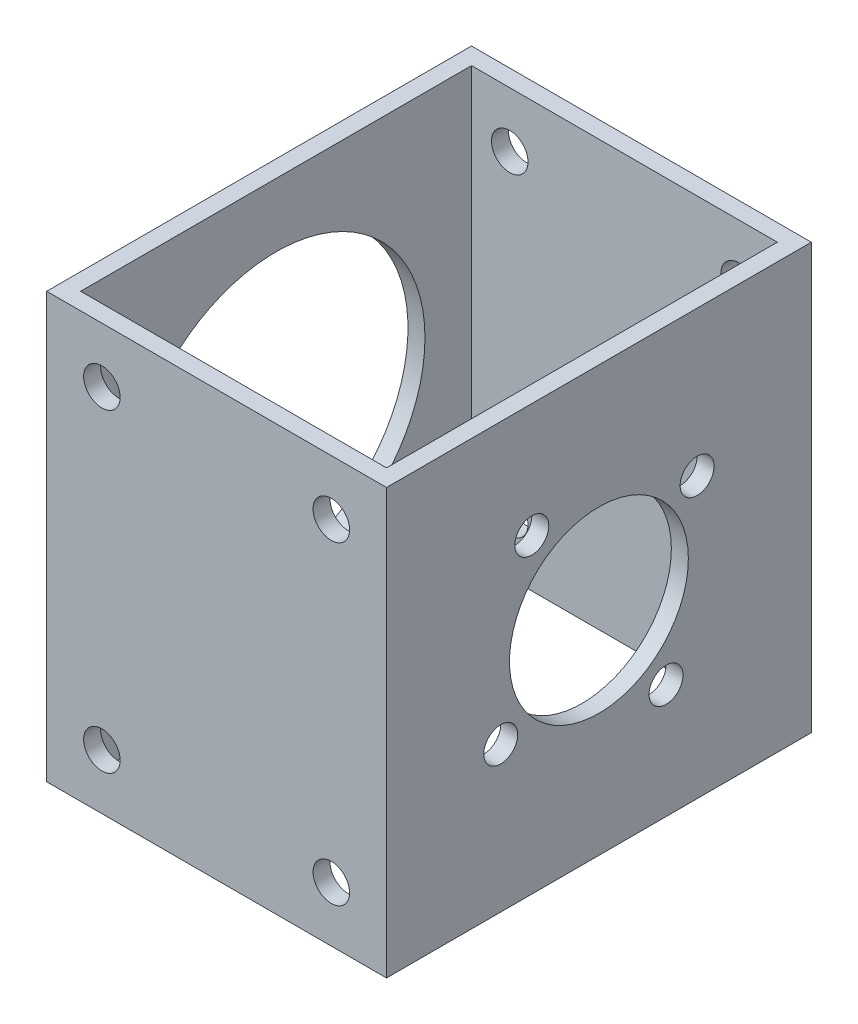
ISO-10303-21;
HEADER;
FILE_DESCRIPTION(('STEP AP214'),'2;1');
FILE_NAME('part.step','',(''),(''),'','','');
FILE_SCHEMA(('AUTOMOTIVE_DESIGN { 1 0 10303 214 1 1 1 1 }'));
ENDSEC;
DATA;
#1=APPLICATION_CONTEXT('core data for automotive mechanical design processes');
#2=APPLICATION_PROTOCOL_DEFINITION('international standard','automotive_design',2000,#1);
#3=PRODUCT_CONTEXT('',#1,'mechanical');
#4=PRODUCT('Part','Part','',(#3));
#5=PRODUCT_RELATED_PRODUCT_CATEGORY('part','',(#4));
#6=PRODUCT_DEFINITION_FORMATION('','',#4);
#7=PRODUCT_DEFINITION_CONTEXT('part definition',#1,'design');
#8=PRODUCT_DEFINITION('design','',#6,#7);
#9=PRODUCT_DEFINITION_SHAPE('','',#8);
#10=(LENGTH_UNIT() NAMED_UNIT(*) SI_UNIT(.MILLI.,.METRE.));
#11=(NAMED_UNIT(*) PLANE_ANGLE_UNIT() SI_UNIT($,.RADIAN.));
#12=(NAMED_UNIT(*) SI_UNIT($,.STERADIAN.) SOLID_ANGLE_UNIT());
#13=UNCERTAINTY_MEASURE_WITH_UNIT(LENGTH_MEASURE(1.E-05),#10,'distance_accuracy_value','');
#14=(GEOMETRIC_REPRESENTATION_CONTEXT(3) GLOBAL_UNCERTAINTY_ASSIGNED_CONTEXT((#13)) GLOBAL_UNIT_ASSIGNED_CONTEXT((#10,
#11,#12)) REPRESENTATION_CONTEXT('',''));
#15=CARTESIAN_POINT('',(0.,0.,0.));
#16=DIRECTION('',(0.,0.,1.));
#17=DIRECTION('',(1.,0.,0.));
#18=AXIS2_PLACEMENT_3D('',#15,#16,#17);
#19=CARTESIAN_POINT('',(0.,50.,0.));
#20=DIRECTION('',(0.,1.,0.));
#21=DIRECTION('',(0.,0.,1.));
#22=AXIS2_PLACEMENT_3D('',#19,#20,#21);
#23=PLANE('',#22);
#24=DIRECTION('',(0.,0.,1.));
#25=VECTOR('',#24,1.);
#26=CARTESIAN_POINT('',(0.,50.,0.));
#27=LINE('',#26,#25);
#28=CARTESIAN_POINT('',(0.,50.,0.));
#29=VERTEX_POINT('',#28);
#30=CARTESIAN_POINT('',(0.,50.,50.));
#31=VERTEX_POINT('',#30);
#32=EDGE_CURVE('E141',#29,#31,#27,.T.);
#33=ORIENTED_EDGE('',*,*,#32,.T.);
#34=DIRECTION('',(1.,0.,0.));
#35=VECTOR('',#34,1.);
#36=CARTESIAN_POINT('',(0.,50.,50.));
#37=LINE('',#36,#35);
#38=CARTESIAN_POINT('',(40.,50.,50.));
#39=VERTEX_POINT('',#38);
#40=EDGE_CURVE('E144',#31,#39,#37,.T.);
#41=ORIENTED_EDGE('',*,*,#40,.T.);
#42=DIRECTION('',(0.,0.,-1.));
#43=VECTOR('',#42,1.);
#44=CARTESIAN_POINT('',(40.,50.,0.));
#45=LINE('',#44,#43);
#46=CARTESIAN_POINT('',(40.,50.,0.));
#47=VERTEX_POINT('',#46);
#48=EDGE_CURVE('E147',#39,#47,#45,.T.);
#49=ORIENTED_EDGE('',*,*,#48,.T.);
#50=DIRECTION('',(-1.,0.,0.));
#51=VECTOR('',#50,1.);
#52=CARTESIAN_POINT('',(0.,50.,0.));
#53=LINE('',#52,#51);
#54=EDGE_CURVE('E149',#47,#29,#53,.T.);
#55=ORIENTED_EDGE('',*,*,#54,.T.);
#56=EDGE_LOOP('',(#33,#41,#49,#55));
#57=FACE_BOUND('',#56,.T.);
#58=DIRECTION('',(1.,0.,0.));
#59=VECTOR('',#58,1.);
#60=CARTESIAN_POINT('',(2.00000000000001,50.,48.));
#61=LINE('',#60,#59);
#62=CARTESIAN_POINT('',(2.00000000000001,50.,48.));
#63=VERTEX_POINT('',#62);
#64=CARTESIAN_POINT('',(38.,50.,48.));
#65=VERTEX_POINT('',#64);
#66=EDGE_CURVE('E111',#63,#65,#61,.T.);
#67=ORIENTED_EDGE('',*,*,#66,.F.);
#68=DIRECTION('',(0.,0.,1.));
#69=VECTOR('',#68,1.);
#70=CARTESIAN_POINT('',(2.,50.,2.));
#71=LINE('',#70,#69);
#72=CARTESIAN_POINT('',(2.,50.,2.));
#73=VERTEX_POINT('',#72);
#74=EDGE_CURVE('E103',#73,#63,#71,.T.);
#75=ORIENTED_EDGE('',*,*,#74,.F.);
#76=DIRECTION('',(-1.,0.,0.));
#77=VECTOR('',#76,1.);
#78=CARTESIAN_POINT('',(2.,50.,2.));
#79=LINE('',#78,#77);
#80=CARTESIAN_POINT('',(38.,50.,2.));
#81=VERTEX_POINT('',#80);
#82=EDGE_CURVE('E125',#81,#73,#79,.T.);
#83=ORIENTED_EDGE('',*,*,#82,.F.);
#84=DIRECTION('',(0.,0.,-1.));
#85=VECTOR('',#84,1.);
#86=CARTESIAN_POINT('',(38.,50.,2.));
#87=LINE('',#86,#85);
#88=EDGE_CURVE('E123',#65,#81,#87,.T.);
#89=ORIENTED_EDGE('',*,*,#88,.F.);
#90=EDGE_LOOP('',(#67,#75,#83,#89));
#91=FACE_BOUND('',#90,.T.);
#92=ADVANCED_FACE('F36',(#57,#91),#23,.T.);
#93=CARTESIAN_POINT('',(0.,0.,0.));
#94=DIRECTION('',(0.,1.,0.));
#95=DIRECTION('',(0.,0.,1.));
#96=AXIS2_PLACEMENT_3D('',#93,#94,#95);
#97=PLANE('',#96);
#98=DIRECTION('',(0.,0.,1.));
#99=VECTOR('',#98,1.);
#100=CARTESIAN_POINT('',(0.,0.,0.));
#101=LINE('',#100,#99);
#102=CARTESIAN_POINT('',(0.,0.,0.));
#103=VERTEX_POINT('',#102);
#104=CARTESIAN_POINT('',(0.,0.,50.));
#105=VERTEX_POINT('',#104);
#106=EDGE_CURVE('E119',#103,#105,#101,.T.);
#107=ORIENTED_EDGE('',*,*,#106,.F.);
#108=DIRECTION('',(-1.,0.,0.));
#109=VECTOR('',#108,1.);
#110=CARTESIAN_POINT('',(0.,0.,0.));
#111=LINE('',#110,#109);
#112=CARTESIAN_POINT('',(40.,0.,0.));
#113=VERTEX_POINT('',#112);
#114=EDGE_CURVE('E145',#113,#103,#111,.T.);
#115=ORIENTED_EDGE('',*,*,#114,.F.);
#116=DIRECTION('',(0.,0.,-1.));
#117=VECTOR('',#116,1.);
#118=CARTESIAN_POINT('',(40.,0.,0.));
#119=LINE('',#118,#117);
#120=CARTESIAN_POINT('',(40.,0.,50.));
#121=VERTEX_POINT('',#120);
#122=EDGE_CURVE('E156',#121,#113,#119,.T.);
#123=ORIENTED_EDGE('',*,*,#122,.F.);
#124=DIRECTION('',(1.,0.,0.));
#125=VECTOR('',#124,1.);
#126=CARTESIAN_POINT('',(0.,0.,50.));
#127=LINE('',#126,#125);
#128=EDGE_CURVE('E154',#105,#121,#127,.T.);
#129=ORIENTED_EDGE('',*,*,#128,.F.);
#130=EDGE_LOOP('',(#107,#115,#123,#129));
#131=FACE_BOUND('',#130,.T.);
#132=DIRECTION('',(0.,0.,1.));
#133=VECTOR('',#132,1.);
#134=CARTESIAN_POINT('',(2.,0.,2.));
#135=LINE('',#134,#133);
#136=CARTESIAN_POINT('',(2.,0.,2.));
#137=VERTEX_POINT('',#136);
#138=CARTESIAN_POINT('',(2.00000000000001,0.,48.));
#139=VERTEX_POINT('',#138);
#140=EDGE_CURVE('E61',#137,#139,#135,.T.);
#141=ORIENTED_EDGE('',*,*,#140,.T.);
#142=DIRECTION('',(1.,0.,0.));
#143=VECTOR('',#142,1.);
#144=CARTESIAN_POINT('',(2.00000000000001,0.,48.));
#145=LINE('',#144,#143);
#146=CARTESIAN_POINT('',(38.,0.,48.));
#147=VERTEX_POINT('',#146);
#148=EDGE_CURVE('E118',#139,#147,#145,.T.);
#149=ORIENTED_EDGE('',*,*,#148,.T.);
#150=DIRECTION('',(0.,0.,-1.));
#151=VECTOR('',#150,1.);
#152=CARTESIAN_POINT('',(38.,0.,2.));
#153=LINE('',#152,#151);
#154=CARTESIAN_POINT('',(38.,0.,2.));
#155=VERTEX_POINT('',#154);
#156=EDGE_CURVE('E133',#147,#155,#153,.T.);
#157=ORIENTED_EDGE('',*,*,#156,.T.);
#158=DIRECTION('',(-1.,0.,0.));
#159=VECTOR('',#158,1.);
#160=CARTESIAN_POINT('',(2.,0.,2.));
#161=LINE('',#160,#159);
#162=EDGE_CURVE('E112',#155,#137,#161,.T.);
#163=ORIENTED_EDGE('',*,*,#162,.T.);
#164=EDGE_LOOP('',(#141,#149,#157,#163));
#165=FACE_BOUND('',#164,.T.);
#166=ADVANCED_FACE('F270',(#131,#165),#97,.F.);
#167=CARTESIAN_POINT('',(0.,50.,0.));
#168=DIRECTION('',(1.,0.,0.));
#169=DIRECTION('',(0.,0.,-1.));
#170=AXIS2_PLACEMENT_3D('',#167,#168,#169);
#171=PLANE('',#170);
#172=CARTESIAN_POINT('',(0.,25.,25.));
#173=DIRECTION('',(-1.,0.,0.));
#174=DIRECTION('',(0.,0.,1.));
#175=AXIS2_PLACEMENT_3D('',#172,#173,#174);
#176=CIRCLE('',#175,17.525);
#177=CARTESIAN_POINT('',(0.,25.,42.525));
#178=VERTEX_POINT('',#177);
#179=EDGE_CURVE('E218',#178,#178,#176,.T.);
#180=ORIENTED_EDGE('',*,*,#179,.F.);
#181=EDGE_LOOP('',(#180));
#182=FACE_BOUND('',#181,.T.);
#183=ORIENTED_EDGE('',*,*,#106,.T.);
#184=DIRECTION('',(0.,-1.,0.));
#185=VECTOR('',#184,1.);
#186=CARTESIAN_POINT('',(0.,50.,50.));
#187=LINE('',#186,#185);
#188=EDGE_CURVE('E11',#31,#105,#187,.T.);
#189=ORIENTED_EDGE('',*,*,#188,.F.);
#190=ORIENTED_EDGE('',*,*,#32,.F.);
#191=DIRECTION('',(0.,-1.,0.));
#192=VECTOR('',#191,1.);
#193=CARTESIAN_POINT('',(0.,50.,0.));
#194=LINE('',#193,#192);
#195=EDGE_CURVE('E151',#29,#103,#194,.T.);
#196=ORIENTED_EDGE('',*,*,#195,.T.);
#197=EDGE_LOOP('',(#183,#189,#190,#196));
#198=FACE_BOUND('',#197,.T.);
#199=ADVANCED_FACE('F38',(#182,#198),#171,.F.);
#200=CARTESIAN_POINT('',(0.,50.,50.));
#201=DIRECTION('',(0.,0.,-1.));
#202=DIRECTION('',(-1.,0.,0.));
#203=AXIS2_PLACEMENT_3D('',#200,#201,#202);
#204=PLANE('',#203);
#205=CARTESIAN_POINT('',(6.5,43.5,50.));
#206=DIRECTION('',(0.,0.,-1.));
#207=DIRECTION('',(-1.,0.,0.));
#208=AXIS2_PLACEMENT_3D('',#205,#206,#207);
#209=CIRCLE('',#208,2.15);
#210=CARTESIAN_POINT('',(4.35,43.5,50.));
#211=VERTEX_POINT('',#210);
#212=EDGE_CURVE('E184',#211,#211,#209,.T.);
#213=ORIENTED_EDGE('',*,*,#212,.T.);
#214=EDGE_LOOP('',(#213));
#215=FACE_BOUND('',#214,.T.);
#216=CARTESIAN_POINT('',(33.5,43.5,50.));
#217=DIRECTION('',(0.,0.,-1.));
#218=DIRECTION('',(-1.,0.,0.));
#219=AXIS2_PLACEMENT_3D('',#216,#217,#218);
#220=CIRCLE('',#219,2.15);
#221=CARTESIAN_POINT('',(31.35,43.5,50.));
#222=VERTEX_POINT('',#221);
#223=EDGE_CURVE('E179',#222,#222,#220,.T.);
#224=ORIENTED_EDGE('',*,*,#223,.T.);
#225=EDGE_LOOP('',(#224));
#226=FACE_BOUND('',#225,.T.);
#227=CARTESIAN_POINT('',(33.5,6.5,50.));
#228=DIRECTION('',(0.,0.,-1.));
#229=DIRECTION('',(-1.,0.,0.));
#230=AXIS2_PLACEMENT_3D('',#227,#228,#229);
#231=CIRCLE('',#230,2.15);
#232=CARTESIAN_POINT('',(31.35,6.5,50.));
#233=VERTEX_POINT('',#232);
#234=EDGE_CURVE('E174',#233,#233,#231,.T.);
#235=ORIENTED_EDGE('',*,*,#234,.T.);
#236=EDGE_LOOP('',(#235));
#237=FACE_BOUND('',#236,.T.);
#238=CARTESIAN_POINT('',(6.5,6.5,50.));
#239=DIRECTION('',(0.,0.,-1.));
#240=DIRECTION('',(-1.,0.,0.));
#241=AXIS2_PLACEMENT_3D('',#238,#239,#240);
#242=CIRCLE('',#241,2.15);
#243=CARTESIAN_POINT('',(4.35,6.5,50.));
#244=VERTEX_POINT('',#243);
#245=EDGE_CURVE('E169',#244,#244,#242,.T.);
#246=ORIENTED_EDGE('',*,*,#245,.T.);
#247=EDGE_LOOP('',(#246));
#248=FACE_BOUND('',#247,.T.);
#249=ORIENTED_EDGE('',*,*,#128,.T.);
#250=DIRECTION('',(0.,-1.,0.));
#251=VECTOR('',#250,1.);
#252=CARTESIAN_POINT('',(40.,50.,50.));
#253=LINE('',#252,#251);
#254=EDGE_CURVE('E45',#39,#121,#253,.T.);
#255=ORIENTED_EDGE('',*,*,#254,.F.);
#256=ORIENTED_EDGE('',*,*,#40,.F.);
#257=ORIENTED_EDGE('',*,*,#188,.T.);
#258=EDGE_LOOP('',(#249,#255,#256,#257));
#259=FACE_BOUND('',#258,.T.);
#260=ADVANCED_FACE('F284',(#215,#226,#237,#248,#259),#204,.F.);
#261=CARTESIAN_POINT('',(40.,50.,0.));
#262=DIRECTION('',(-1.,0.,0.));
#263=DIRECTION('',(0.,0.,1.));
#264=AXIS2_PLACEMENT_3D('',#261,#262,#263);
#265=PLANE('',#264);
#266=CARTESIAN_POINT('',(40.,32.9,13.4418859669927));
#267=DIRECTION('',(1.,0.,0.));
#268=DIRECTION('',(0.,0.,-1.));
#269=AXIS2_PLACEMENT_3D('',#266,#267,#268);
#270=CIRCLE('',#269,2.00000000000001);
#271=CARTESIAN_POINT('',(40.,32.9,11.4418859669927));
#272=VERTEX_POINT('',#271);
#273=EDGE_CURVE('E205',#272,#272,#270,.T.);
#274=ORIENTED_EDGE('',*,*,#273,.F.);
#275=EDGE_LOOP('',(#274));
#276=FACE_BOUND('',#275,.T.);
#277=CARTESIAN_POINT('',(40.,36.5581140330073,32.9));
#278=DIRECTION('',(1.,0.,0.));
#279=DIRECTION('',(0.,0.,-1.));
#280=AXIS2_PLACEMENT_3D('',#277,#278,#279);
#281=CIRCLE('',#280,2.);
#282=CARTESIAN_POINT('',(40.,36.5581140330073,30.9));
#283=VERTEX_POINT('',#282);
#284=EDGE_CURVE('E195',#283,#283,#281,.T.);
#285=ORIENTED_EDGE('',*,*,#284,.F.);
#286=EDGE_LOOP('',(#285));
#287=FACE_BOUND('',#286,.T.);
#288=CARTESIAN_POINT('',(40.,17.1,36.5581140330073));
#289=DIRECTION('',(1.,0.,0.));
#290=DIRECTION('',(0.,0.,-1.));
#291=AXIS2_PLACEMENT_3D('',#288,#289,#290);
#292=CIRCLE('',#291,2.);
#293=CARTESIAN_POINT('',(40.,17.1,34.5581140330073));
#294=VERTEX_POINT('',#293);
#295=EDGE_CURVE('E192',#294,#294,#292,.T.);
#296=ORIENTED_EDGE('',*,*,#295,.F.);
#297=EDGE_LOOP('',(#296));
#298=FACE_BOUND('',#297,.T.);
#299=CARTESIAN_POINT('',(40.,13.4418859669927,17.1));
#300=DIRECTION('',(1.,0.,0.));
#301=DIRECTION('',(0.,0.,-1.));
#302=AXIS2_PLACEMENT_3D('',#299,#300,#301);
#303=CIRCLE('',#302,2.);
#304=CARTESIAN_POINT('',(40.,13.4418859669927,15.1));
#305=VERTEX_POINT('',#304);
#306=EDGE_CURVE('E189',#305,#305,#303,.T.);
#307=ORIENTED_EDGE('',*,*,#306,.F.);
#308=EDGE_LOOP('',(#307));
#309=FACE_BOUND('',#308,.T.);
#310=CARTESIAN_POINT('',(40.,25.,25.));
#311=DIRECTION('',(1.,0.,0.));
#312=DIRECTION('',(0.,0.,-1.));
#313=AXIS2_PLACEMENT_3D('',#310,#311,#312);
#314=CIRCLE('',#313,10.525);
#315=CARTESIAN_POINT('',(40.,25.,14.475));
#316=VERTEX_POINT('',#315);
#317=EDGE_CURVE('E210',#316,#316,#314,.T.);
#318=ORIENTED_EDGE('',*,*,#317,.F.);
#319=EDGE_LOOP('',(#318));
#320=FACE_BOUND('',#319,.T.);
#321=ORIENTED_EDGE('',*,*,#122,.T.);
#322=DIRECTION('',(0.,-1.,0.));
#323=VECTOR('',#322,1.);
#324=CARTESIAN_POINT('',(40.,50.,0.));
#325=LINE('',#324,#323);
#326=EDGE_CURVE('E161',#47,#113,#325,.T.);
#327=ORIENTED_EDGE('',*,*,#326,.F.);
#328=ORIENTED_EDGE('',*,*,#48,.F.);
#329=ORIENTED_EDGE('',*,*,#254,.T.);
#330=EDGE_LOOP('',(#321,#327,#328,#329));
#331=FACE_BOUND('',#330,.T.);
#332=ADVANCED_FACE('F281',(#276,#287,#298,#309,#320,#331),#265,.F.);
#333=CARTESIAN_POINT('',(0.,50.,0.));
#334=DIRECTION('',(0.,0.,1.));
#335=DIRECTION('',(1.,0.,0.));
#336=AXIS2_PLACEMENT_3D('',#333,#334,#335);
#337=PLANE('',#336);
#338=CARTESIAN_POINT('',(6.5,43.5,0.));
#339=DIRECTION('',(0.,0.,-1.));
#340=DIRECTION('',(-1.,0.,0.));
#341=AXIS2_PLACEMENT_3D('',#338,#339,#340);
#342=CIRCLE('',#341,2.15);
#343=CARTESIAN_POINT('',(4.35,43.5,0.));
#344=VERTEX_POINT('',#343);
#345=EDGE_CURVE('E221',#344,#344,#342,.T.);
#346=ORIENTED_EDGE('',*,*,#345,.F.);
#347=EDGE_LOOP('',(#346));
#348=FACE_BOUND('',#347,.T.);
#349=CARTESIAN_POINT('',(33.5,43.5,0.));
#350=DIRECTION('',(0.,0.,-1.));
#351=DIRECTION('',(-1.,0.,0.));
#352=AXIS2_PLACEMENT_3D('',#349,#350,#351);
#353=CIRCLE('',#352,2.15);
#354=CARTESIAN_POINT('',(31.35,43.5,0.));
#355=VERTEX_POINT('',#354);
#356=EDGE_CURVE('E228',#355,#355,#353,.T.);
#357=ORIENTED_EDGE('',*,*,#356,.F.);
#358=EDGE_LOOP('',(#357));
#359=FACE_BOUND('',#358,.T.);
#360=CARTESIAN_POINT('',(33.5,6.5,0.));
#361=DIRECTION('',(0.,0.,-1.));
#362=DIRECTION('',(-1.,0.,0.));
#363=AXIS2_PLACEMENT_3D('',#360,#361,#362);
#364=CIRCLE('',#363,2.15);
#365=CARTESIAN_POINT('',(31.35,6.5,0.));
#366=VERTEX_POINT('',#365);
#367=EDGE_CURVE('E235',#366,#366,#364,.T.);
#368=ORIENTED_EDGE('',*,*,#367,.F.);
#369=EDGE_LOOP('',(#368));
#370=FACE_BOUND('',#369,.T.);
#371=CARTESIAN_POINT('',(6.5,6.5,0.));
#372=DIRECTION('',(0.,0.,-1.));
#373=DIRECTION('',(-1.,0.,0.));
#374=AXIS2_PLACEMENT_3D('',#371,#372,#373);
#375=CIRCLE('',#374,2.15);
#376=CARTESIAN_POINT('',(4.35,6.5,0.));
#377=VERTEX_POINT('',#376);
#378=EDGE_CURVE('E242',#377,#377,#375,.T.);
#379=ORIENTED_EDGE('',*,*,#378,.F.);
#380=EDGE_LOOP('',(#379));
#381=FACE_BOUND('',#380,.T.);
#382=ORIENTED_EDGE('',*,*,#114,.T.);
#383=ORIENTED_EDGE('',*,*,#195,.F.);
#384=ORIENTED_EDGE('',*,*,#54,.F.);
#385=ORIENTED_EDGE('',*,*,#326,.T.);
#386=EDGE_LOOP('',(#382,#383,#384,#385));
#387=FACE_BOUND('',#386,.T.);
#388=ADVANCED_FACE('F264',(#348,#359,#370,#381,#387),#337,.F.);
#389=CARTESIAN_POINT('',(2.,50.,2.));
#390=DIRECTION('',(1.,0.,0.));
#391=DIRECTION('',(0.,0.,-1.));
#392=AXIS2_PLACEMENT_3D('',#389,#390,#391);
#393=PLANE('',#392);
#394=CARTESIAN_POINT('',(2.,25.,25.));
#395=DIRECTION('',(1.,0.,0.));
#396=DIRECTION('',(0.,0.,-1.));
#397=AXIS2_PLACEMENT_3D('',#394,#395,#396);
#398=CIRCLE('',#397,17.525);
#399=CARTESIAN_POINT('',(2.,25.,7.475));
#400=VERTEX_POINT('',#399);
#401=EDGE_CURVE('E213',#400,#400,#398,.F.);
#402=ORIENTED_EDGE('',*,*,#401,.T.);
#403=EDGE_LOOP('',(#402));
#404=FACE_BOUND('',#403,.T.);
#405=ORIENTED_EDGE('',*,*,#140,.F.);
#406=DIRECTION('',(0.,-1.,0.));
#407=VECTOR('',#406,1.);
#408=CARTESIAN_POINT('',(2.,50.,2.));
#409=LINE('',#408,#407);
#410=EDGE_CURVE('E107',#73,#137,#409,.T.);
#411=ORIENTED_EDGE('',*,*,#410,.F.);
#412=ORIENTED_EDGE('',*,*,#74,.T.);
#413=DIRECTION('',(0.,-1.,0.));
#414=VECTOR('',#413,1.);
#415=CARTESIAN_POINT('',(2.00000000000001,50.,48.));
#416=LINE('',#415,#414);
#417=EDGE_CURVE('E106',#63,#139,#416,.T.);
#418=ORIENTED_EDGE('',*,*,#417,.T.);
#419=EDGE_LOOP('',(#405,#411,#412,#418));
#420=FACE_BOUND('',#419,.T.);
#421=ADVANCED_FACE('F105',(#404,#420),#393,.T.);
#422=CARTESIAN_POINT('',(2.00000000000001,50.,48.));
#423=DIRECTION('',(0.,0.,-1.));
#424=DIRECTION('',(-1.,0.,0.));
#425=AXIS2_PLACEMENT_3D('',#422,#423,#424);
#426=PLANE('',#425);
#427=CARTESIAN_POINT('',(6.5,43.5,48.));
#428=DIRECTION('',(0.,0.,-1.));
#429=DIRECTION('',(-1.,0.,0.));
#430=AXIS2_PLACEMENT_3D('',#427,#428,#429);
#431=CIRCLE('',#430,2.15);
#432=CARTESIAN_POINT('',(4.35,43.5,48.));
#433=VERTEX_POINT('',#432);
#434=EDGE_CURVE('E183',#433,#433,#431,.T.);
#435=ORIENTED_EDGE('',*,*,#434,.F.);
#436=EDGE_LOOP('',(#435));
#437=FACE_BOUND('',#436,.T.);
#438=CARTESIAN_POINT('',(33.5,43.5,48.));
#439=DIRECTION('',(0.,0.,-1.));
#440=DIRECTION('',(-1.,0.,0.));
#441=AXIS2_PLACEMENT_3D('',#438,#439,#440);
#442=CIRCLE('',#441,2.15);
#443=CARTESIAN_POINT('',(31.35,43.5,48.));
#444=VERTEX_POINT('',#443);
#445=EDGE_CURVE('E178',#444,#444,#442,.T.);
#446=ORIENTED_EDGE('',*,*,#445,.F.);
#447=EDGE_LOOP('',(#446));
#448=FACE_BOUND('',#447,.T.);
#449=CARTESIAN_POINT('',(33.5,6.5,48.));
#450=DIRECTION('',(0.,0.,-1.));
#451=DIRECTION('',(-1.,0.,0.));
#452=AXIS2_PLACEMENT_3D('',#449,#450,#451);
#453=CIRCLE('',#452,2.15);
#454=CARTESIAN_POINT('',(31.35,6.5,48.));
#455=VERTEX_POINT('',#454);
#456=EDGE_CURVE('E173',#455,#455,#453,.T.);
#457=ORIENTED_EDGE('',*,*,#456,.F.);
#458=EDGE_LOOP('',(#457));
#459=FACE_BOUND('',#458,.T.);
#460=CARTESIAN_POINT('',(6.5,6.5,48.));
#461=DIRECTION('',(0.,0.,-1.));
#462=DIRECTION('',(-1.,0.,0.));
#463=AXIS2_PLACEMENT_3D('',#460,#461,#462);
#464=CIRCLE('',#463,2.15);
#465=CARTESIAN_POINT('',(4.35,6.5,48.));
#466=VERTEX_POINT('',#465);
#467=EDGE_CURVE('E131',#466,#466,#464,.T.);
#468=ORIENTED_EDGE('',*,*,#467,.F.);
#469=EDGE_LOOP('',(#468));
#470=FACE_BOUND('',#469,.T.);
#471=ORIENTED_EDGE('',*,*,#148,.F.);
#472=ORIENTED_EDGE('',*,*,#417,.F.);
#473=ORIENTED_EDGE('',*,*,#66,.T.);
#474=DIRECTION('',(0.,-1.,0.));
#475=VECTOR('',#474,1.);
#476=CARTESIAN_POINT('',(38.,50.,48.));
#477=LINE('',#476,#475);
#478=EDGE_CURVE('E120',#65,#147,#477,.T.);
#479=ORIENTED_EDGE('',*,*,#478,.T.);
#480=EDGE_LOOP('',(#471,#472,#473,#479));
#481=FACE_BOUND('',#480,.T.);
#482=ADVANCED_FACE('F115',(#437,#448,#459,#470,#481),#426,.T.);
#483=CARTESIAN_POINT('',(38.,50.,2.));
#484=DIRECTION('',(-1.,0.,0.));
#485=DIRECTION('',(0.,0.,1.));
#486=AXIS2_PLACEMENT_3D('',#483,#484,#485);
#487=PLANE('',#486);
#488=CARTESIAN_POINT('',(38.,32.9,13.4418859669927));
#489=DIRECTION('',(-1.,0.,0.));
#490=DIRECTION('',(0.,0.,1.));
#491=AXIS2_PLACEMENT_3D('',#488,#489,#490);
#492=CIRCLE('',#491,2.00000000000001);
#493=CARTESIAN_POINT('',(38.,32.9,15.4418859669927));
#494=VERTEX_POINT('',#493);
#495=EDGE_CURVE('E40',#494,#494,#492,.T.);
#496=ORIENTED_EDGE('',*,*,#495,.F.);
#497=EDGE_LOOP('',(#496));
#498=FACE_BOUND('',#497,.T.);
#499=CARTESIAN_POINT('',(38.,36.5581140330073,32.9));
#500=DIRECTION('',(-1.,0.,0.));
#501=DIRECTION('',(0.,0.,1.));
#502=AXIS2_PLACEMENT_3D('',#499,#500,#501);
#503=CIRCLE('',#502,2.);
#504=CARTESIAN_POINT('',(38.,36.5581140330073,34.9));
#505=VERTEX_POINT('',#504);
#506=EDGE_CURVE('E193',#505,#505,#503,.T.);
#507=ORIENTED_EDGE('',*,*,#506,.F.);
#508=EDGE_LOOP('',(#507));
#509=FACE_BOUND('',#508,.T.);
#510=CARTESIAN_POINT('',(38.,17.1,36.5581140330073));
#511=DIRECTION('',(-1.,0.,0.));
#512=DIRECTION('',(0.,0.,1.));
#513=AXIS2_PLACEMENT_3D('',#510,#511,#512);
#514=CIRCLE('',#513,2.);
#515=CARTESIAN_POINT('',(38.,17.1,38.5581140330073));
#516=VERTEX_POINT('',#515);
#517=EDGE_CURVE('E190',#516,#516,#514,.T.);
#518=ORIENTED_EDGE('',*,*,#517,.F.);
#519=EDGE_LOOP('',(#518));
#520=FACE_BOUND('',#519,.T.);
#521=CARTESIAN_POINT('',(38.,13.4418859669927,17.1));
#522=DIRECTION('',(-1.,0.,0.));
#523=DIRECTION('',(0.,0.,1.));
#524=AXIS2_PLACEMENT_3D('',#521,#522,#523);
#525=CIRCLE('',#524,2.);
#526=CARTESIAN_POINT('',(38.,13.4418859669927,19.1));
#527=VERTEX_POINT('',#526);
#528=EDGE_CURVE('E185',#527,#527,#525,.T.);
#529=ORIENTED_EDGE('',*,*,#528,.F.);
#530=EDGE_LOOP('',(#529));
#531=FACE_BOUND('',#530,.T.);
#532=CARTESIAN_POINT('',(38.,25.,25.));
#533=DIRECTION('',(-1.,0.,0.));
#534=DIRECTION('',(0.,0.,1.));
#535=AXIS2_PLACEMENT_3D('',#532,#533,#534);
#536=CIRCLE('',#535,10.525);
#537=CARTESIAN_POINT('',(38.,25.,35.525));
#538=VERTEX_POINT('',#537);
#539=EDGE_CURVE('E188',#538,#538,#536,.F.);
#540=ORIENTED_EDGE('',*,*,#539,.T.);
#541=EDGE_LOOP('',(#540));
#542=FACE_BOUND('',#541,.T.);
#543=ORIENTED_EDGE('',*,*,#156,.F.);
#544=ORIENTED_EDGE('',*,*,#478,.F.);
#545=ORIENTED_EDGE('',*,*,#88,.T.);
#546=DIRECTION('',(0.,-1.,0.));
#547=VECTOR('',#546,1.);
#548=CARTESIAN_POINT('',(38.,50.,2.));
#549=LINE('',#548,#547);
#550=EDGE_CURVE('E53',#81,#155,#549,.T.);
#551=ORIENTED_EDGE('',*,*,#550,.T.);
#552=EDGE_LOOP('',(#543,#544,#545,#551));
#553=FACE_BOUND('',#552,.T.);
#554=ADVANCED_FACE('F253',(#498,#509,#520,#531,#542,#553),#487,.T.);
#555=CARTESIAN_POINT('',(2.,50.,2.));
#556=DIRECTION('',(0.,0.,1.));
#557=DIRECTION('',(1.,0.,0.));
#558=AXIS2_PLACEMENT_3D('',#555,#556,#557);
#559=PLANE('',#558);
#560=CARTESIAN_POINT('',(6.5,43.5,2.));
#561=DIRECTION('',(0.,0.,1.));
#562=DIRECTION('',(1.,0.,0.));
#563=AXIS2_PLACEMENT_3D('',#560,#561,#562);
#564=CIRCLE('',#563,2.15);
#565=CARTESIAN_POINT('',(8.65,43.5,2.));
#566=VERTEX_POINT('',#565);
#567=EDGE_CURVE('E180',#566,#566,#564,.T.);
#568=ORIENTED_EDGE('',*,*,#567,.F.);
#569=EDGE_LOOP('',(#568));
#570=FACE_BOUND('',#569,.T.);
#571=CARTESIAN_POINT('',(33.5,43.5,2.));
#572=DIRECTION('',(0.,0.,1.));
#573=DIRECTION('',(1.,0.,0.));
#574=AXIS2_PLACEMENT_3D('',#571,#572,#573);
#575=CIRCLE('',#574,2.15);
#576=CARTESIAN_POINT('',(35.65,43.5,2.));
#577=VERTEX_POINT('',#576);
#578=EDGE_CURVE('E175',#577,#577,#575,.T.);
#579=ORIENTED_EDGE('',*,*,#578,.F.);
#580=EDGE_LOOP('',(#579));
#581=FACE_BOUND('',#580,.T.);
#582=CARTESIAN_POINT('',(33.5,6.5,2.));
#583=DIRECTION('',(0.,0.,1.));
#584=DIRECTION('',(1.,0.,0.));
#585=AXIS2_PLACEMENT_3D('',#582,#583,#584);
#586=CIRCLE('',#585,2.15);
#587=CARTESIAN_POINT('',(35.65,6.5,2.));
#588=VERTEX_POINT('',#587);
#589=EDGE_CURVE('E170',#588,#588,#586,.T.);
#590=ORIENTED_EDGE('',*,*,#589,.F.);
#591=EDGE_LOOP('',(#590));
#592=FACE_BOUND('',#591,.T.);
#593=CARTESIAN_POINT('',(6.5,6.5,2.));
#594=DIRECTION('',(0.,0.,1.));
#595=DIRECTION('',(1.,0.,0.));
#596=AXIS2_PLACEMENT_3D('',#593,#594,#595);
#597=CIRCLE('',#596,2.15);
#598=CARTESIAN_POINT('',(8.65,6.5,2.));
#599=VERTEX_POINT('',#598);
#600=EDGE_CURVE('E166',#599,#599,#597,.T.);
#601=ORIENTED_EDGE('',*,*,#600,.F.);
#602=EDGE_LOOP('',(#601));
#603=FACE_BOUND('',#602,.T.);
#604=ORIENTED_EDGE('',*,*,#162,.F.);
#605=ORIENTED_EDGE('',*,*,#550,.F.);
#606=ORIENTED_EDGE('',*,*,#82,.T.);
#607=ORIENTED_EDGE('',*,*,#410,.T.);
#608=EDGE_LOOP('',(#604,#605,#606,#607));
#609=FACE_BOUND('',#608,.T.);
#610=ADVANCED_FACE('F261',(#570,#581,#592,#603,#609),#559,.T.);
#611=CARTESIAN_POINT('',(6.5,6.5,50.));
#612=DIRECTION('',(0.,0.,-1.));
#613=DIRECTION('',(-1.,0.,0.));
#614=AXIS2_PLACEMENT_3D('',#611,#612,#613);
#615=CYLINDRICAL_SURFACE('',#614,2.15);
#616=ORIENTED_EDGE('',*,*,#600,.T.);
#617=EDGE_LOOP('',(#616));
#618=FACE_BOUND('',#617,.T.);
#619=ORIENTED_EDGE('',*,*,#378,.T.);
#620=EDGE_LOOP('',(#619));
#621=FACE_BOUND('',#620,.T.);
#622=ADVANCED_FACE('F317',(#618,#621),#615,.F.);
#623=ORIENTED_EDGE('',*,*,#467,.T.);
#624=EDGE_LOOP('',(#623));
#625=FACE_BOUND('',#624,.T.);
#626=ORIENTED_EDGE('',*,*,#245,.F.);
#627=EDGE_LOOP('',(#626));
#628=FACE_BOUND('',#627,.T.);
#629=ADVANCED_FACE('F249',(#625,#628),#615,.F.);
#630=CARTESIAN_POINT('',(33.5,6.5,50.));
#631=DIRECTION('',(0.,0.,-1.));
#632=DIRECTION('',(-1.,0.,0.));
#633=AXIS2_PLACEMENT_3D('',#630,#631,#632);
#634=CYLINDRICAL_SURFACE('',#633,2.15);
#635=ORIENTED_EDGE('',*,*,#589,.T.);
#636=EDGE_LOOP('',(#635));
#637=FACE_BOUND('',#636,.T.);
#638=ORIENTED_EDGE('',*,*,#367,.T.);
#639=EDGE_LOOP('',(#638));
#640=FACE_BOUND('',#639,.T.);
#641=ADVANCED_FACE('F328',(#637,#640),#634,.F.);
#642=ORIENTED_EDGE('',*,*,#456,.T.);
#643=EDGE_LOOP('',(#642));
#644=FACE_BOUND('',#643,.T.);
#645=ORIENTED_EDGE('',*,*,#234,.F.);
#646=EDGE_LOOP('',(#645));
#647=FACE_BOUND('',#646,.T.);
#648=ADVANCED_FACE('F331',(#644,#647),#634,.F.);
#649=CARTESIAN_POINT('',(33.5,43.5,50.));
#650=DIRECTION('',(0.,0.,-1.));
#651=DIRECTION('',(-1.,0.,0.));
#652=AXIS2_PLACEMENT_3D('',#649,#650,#651);
#653=CYLINDRICAL_SURFACE('',#652,2.15);
#654=ORIENTED_EDGE('',*,*,#578,.T.);
#655=EDGE_LOOP('',(#654));
#656=FACE_BOUND('',#655,.T.);
#657=ORIENTED_EDGE('',*,*,#356,.T.);
#658=EDGE_LOOP('',(#657));
#659=FACE_BOUND('',#658,.T.);
#660=ADVANCED_FACE('F333',(#656,#659),#653,.F.);
#661=ORIENTED_EDGE('',*,*,#445,.T.);
#662=EDGE_LOOP('',(#661));
#663=FACE_BOUND('',#662,.T.);
#664=ORIENTED_EDGE('',*,*,#223,.F.);
#665=EDGE_LOOP('',(#664));
#666=FACE_BOUND('',#665,.T.);
#667=ADVANCED_FACE('F336',(#663,#666),#653,.F.);
#668=CARTESIAN_POINT('',(6.5,43.5,50.));
#669=DIRECTION('',(0.,0.,-1.));
#670=DIRECTION('',(-1.,0.,0.));
#671=AXIS2_PLACEMENT_3D('',#668,#669,#670);
#672=CYLINDRICAL_SURFACE('',#671,2.15);
#673=ORIENTED_EDGE('',*,*,#567,.T.);
#674=EDGE_LOOP('',(#673));
#675=FACE_BOUND('',#674,.T.);
#676=ORIENTED_EDGE('',*,*,#345,.T.);
#677=EDGE_LOOP('',(#676));
#678=FACE_BOUND('',#677,.T.);
#679=ADVANCED_FACE('F338',(#675,#678),#672,.F.);
#680=ORIENTED_EDGE('',*,*,#434,.T.);
#681=EDGE_LOOP('',(#680));
#682=FACE_BOUND('',#681,.T.);
#683=ORIENTED_EDGE('',*,*,#212,.F.);
#684=EDGE_LOOP('',(#683));
#685=FACE_BOUND('',#684,.T.);
#686=ADVANCED_FACE('F341',(#682,#685),#672,.F.);
#687=CARTESIAN_POINT('',(40.001,25.,25.));
#688=DIRECTION('',(-1.,0.,0.));
#689=DIRECTION('',(0.,0.,1.));
#690=AXIS2_PLACEMENT_3D('',#687,#688,#689);
#691=CYLINDRICAL_SURFACE('',#690,17.525);
#692=ORIENTED_EDGE('',*,*,#401,.F.);
#693=EDGE_LOOP('',(#692));
#694=FACE_BOUND('',#693,.T.);
#695=ORIENTED_EDGE('',*,*,#179,.T.);
#696=EDGE_LOOP('',(#695));
#697=FACE_BOUND('',#696,.T.);
#698=ADVANCED_FACE('F343',(#694,#697),#691,.F.);
#699=CARTESIAN_POINT('',(-0.001000000000001,25.,25.));
#700=DIRECTION('',(1.,0.,0.));
#701=DIRECTION('',(0.,0.,-1.));
#702=AXIS2_PLACEMENT_3D('',#699,#700,#701);
#703=CYLINDRICAL_SURFACE('',#702,10.525);
#704=ORIENTED_EDGE('',*,*,#539,.F.);
#705=EDGE_LOOP('',(#704));
#706=FACE_BOUND('',#705,.T.);
#707=ORIENTED_EDGE('',*,*,#317,.T.);
#708=EDGE_LOOP('',(#707));
#709=FACE_BOUND('',#708,.T.);
#710=ADVANCED_FACE('F346',(#706,#709),#703,.F.);
#711=CARTESIAN_POINT('',(30.,13.4418859669927,17.1));
#712=DIRECTION('',(1.,0.,0.));
#713=DIRECTION('',(0.,0.,-1.));
#714=AXIS2_PLACEMENT_3D('',#711,#712,#713);
#715=CYLINDRICAL_SURFACE('',#714,2.);
#716=ORIENTED_EDGE('',*,*,#528,.T.);
#717=EDGE_LOOP('',(#716));
#718=FACE_BOUND('',#717,.T.);
#719=ORIENTED_EDGE('',*,*,#306,.T.);
#720=EDGE_LOOP('',(#719));
#721=FACE_BOUND('',#720,.T.);
#722=ADVANCED_FACE('F350',(#718,#721),#715,.F.);
#723=CARTESIAN_POINT('',(30.,17.1,36.5581140330073));
#724=DIRECTION('',(1.,0.,0.));
#725=DIRECTION('',(0.,0.,-1.));
#726=AXIS2_PLACEMENT_3D('',#723,#724,#725);
#727=CYLINDRICAL_SURFACE('',#726,2.);
#728=ORIENTED_EDGE('',*,*,#517,.T.);
#729=EDGE_LOOP('',(#728));
#730=FACE_BOUND('',#729,.T.);
#731=ORIENTED_EDGE('',*,*,#295,.T.);
#732=EDGE_LOOP('',(#731));
#733=FACE_BOUND('',#732,.T.);
#734=ADVANCED_FACE('F354',(#730,#733),#727,.F.);
#735=CARTESIAN_POINT('',(30.,36.5581140330073,32.9));
#736=DIRECTION('',(1.,0.,0.));
#737=DIRECTION('',(0.,0.,-1.));
#738=AXIS2_PLACEMENT_3D('',#735,#736,#737);
#739=CYLINDRICAL_SURFACE('',#738,2.);
#740=ORIENTED_EDGE('',*,*,#506,.T.);
#741=EDGE_LOOP('',(#740));
#742=FACE_BOUND('',#741,.T.);
#743=ORIENTED_EDGE('',*,*,#284,.T.);
#744=EDGE_LOOP('',(#743));
#745=FACE_BOUND('',#744,.T.);
#746=ADVANCED_FACE('F358',(#742,#745),#739,.F.);
#747=CARTESIAN_POINT('',(30.,32.9,13.4418859669927));
#748=DIRECTION('',(1.,0.,0.));
#749=DIRECTION('',(0.,0.,-1.));
#750=AXIS2_PLACEMENT_3D('',#747,#748,#749);
#751=CYLINDRICAL_SURFACE('',#750,2.00000000000001);
#752=ORIENTED_EDGE('',*,*,#495,.T.);
#753=EDGE_LOOP('',(#752));
#754=FACE_BOUND('',#753,.T.);
#755=ORIENTED_EDGE('',*,*,#273,.T.);
#756=EDGE_LOOP('',(#755));
#757=FACE_BOUND('',#756,.T.);
#758=ADVANCED_FACE('F362',(#754,#757),#751,.F.);
#759=CLOSED_SHELL('',(#92,#166,#199,#260,#332,#388,#421,#482,#554,#610,#622,#629,#641,#648,#660,
#667,#679,#686,#698,#710,#722,#734,#746,#758));
#760=MANIFOLD_SOLID_BREP('B2',#759);
#761=ADVANCED_BREP_SHAPE_REPRESENTATION('',(#18,#760),#14);
#762=SHAPE_DEFINITION_REPRESENTATION(#9,#761);
ENDSEC;
END-ISO-10303-21;
